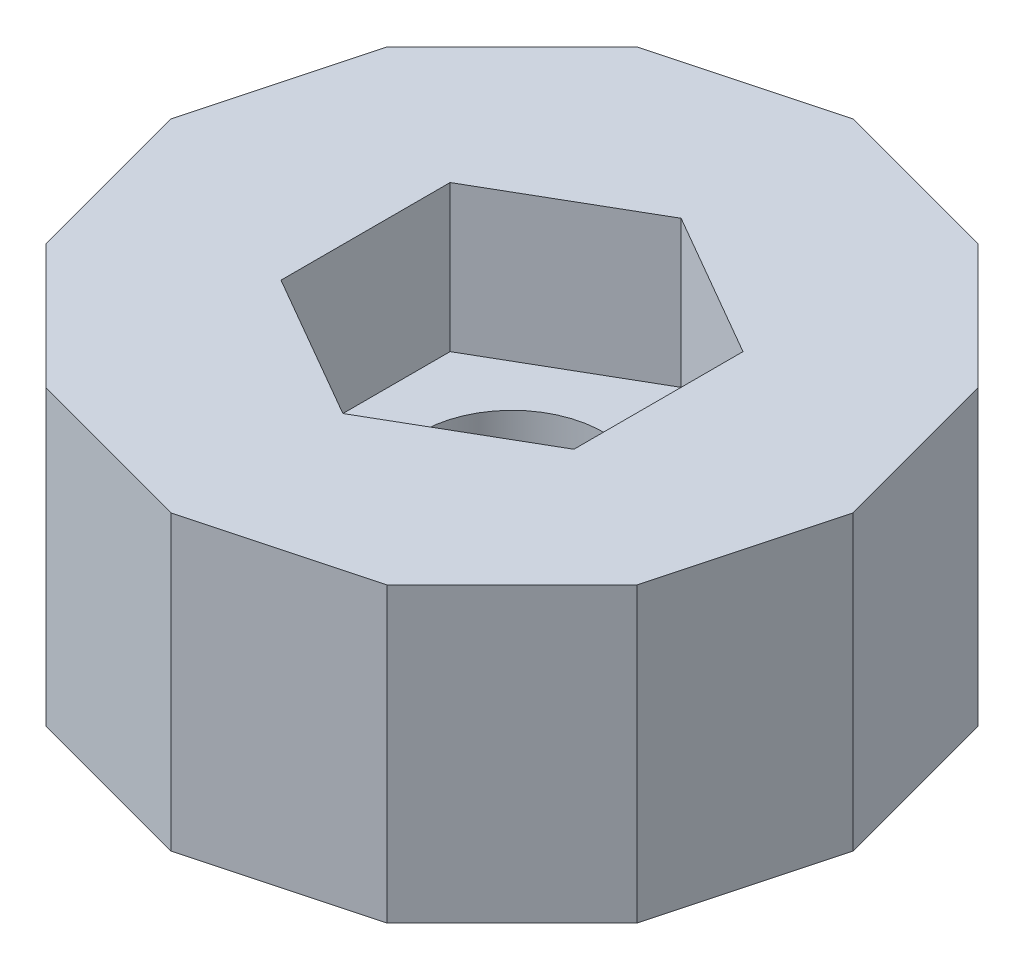
ISO-10303-21;
HEADER;
FILE_DESCRIPTION(('STEP AP214'),'2;1');
FILE_NAME('part.step','',(''),(''),'','','');
FILE_SCHEMA(('AUTOMOTIVE_DESIGN { 1 0 10303 214 1 1 1 1 }'));
ENDSEC;
DATA;
#1=APPLICATION_CONTEXT('core data for automotive mechanical design processes');
#2=APPLICATION_PROTOCOL_DEFINITION('international standard','automotive_design',2000,#1);
#3=PRODUCT_CONTEXT('',#1,'mechanical');
#4=PRODUCT('Part','Part','',(#3));
#5=PRODUCT_RELATED_PRODUCT_CATEGORY('part','',(#4));
#6=PRODUCT_DEFINITION_FORMATION('','',#4);
#7=PRODUCT_DEFINITION_CONTEXT('part definition',#1,'design');
#8=PRODUCT_DEFINITION('design','',#6,#7);
#9=PRODUCT_DEFINITION_SHAPE('','',#8);
#10=(LENGTH_UNIT() NAMED_UNIT(*) SI_UNIT(.MILLI.,.METRE.));
#11=(NAMED_UNIT(*) PLANE_ANGLE_UNIT() SI_UNIT($,.RADIAN.));
#12=(NAMED_UNIT(*) SI_UNIT($,.STERADIAN.) SOLID_ANGLE_UNIT());
#13=UNCERTAINTY_MEASURE_WITH_UNIT(LENGTH_MEASURE(1.E-05),#10,'distance_accuracy_value','');
#14=(GEOMETRIC_REPRESENTATION_CONTEXT(3) GLOBAL_UNCERTAINTY_ASSIGNED_CONTEXT((#13)) GLOBAL_UNIT_ASSIGNED_CONTEXT((#10,
#11,#12)) REPRESENTATION_CONTEXT('',''));
#15=CARTESIAN_POINT('',(0.,0.,0.));
#16=DIRECTION('',(0.,0.,1.));
#17=DIRECTION('',(1.,0.,0.));
#18=AXIS2_PLACEMENT_3D('',#15,#16,#17);
#19=CARTESIAN_POINT('',(2.,8.,-3.46410161513776));
#20=DIRECTION('',(-0.5,0.,0.866025403784439));
#21=DIRECTION('',(0.866025403784439,0.,0.5));
#22=AXIS2_PLACEMENT_3D('',#19,#20,#21);
#23=PLANE('',#22);
#24=DIRECTION('',(-0.866025403784439,0.,-0.5));
#25=VECTOR('',#24,1.);
#26=CARTESIAN_POINT('',(2.,4.,-3.46410161513776));
#27=LINE('',#26,#25);
#28=CARTESIAN_POINT('',(4.,4.,-2.30940107675851));
#29=VERTEX_POINT('',#28);
#30=CARTESIAN_POINT('',(0.,4.,-4.61880215351701));
#31=VERTEX_POINT('',#30);
#32=EDGE_CURVE('E52',#29,#31,#27,.T.);
#33=ORIENTED_EDGE('',*,*,#32,.F.);
#34=DIRECTION('',(0.,-1.,0.));
#35=VECTOR('',#34,1.);
#36=CARTESIAN_POINT('',(4.,8.,-2.30940107675851));
#37=LINE('',#36,#35);
#38=CARTESIAN_POINT('',(4.,8.,-2.30940107675851));
#39=VERTEX_POINT('',#38);
#40=EDGE_CURVE('E11',#39,#29,#37,.T.);
#41=ORIENTED_EDGE('',*,*,#40,.F.);
#42=DIRECTION('',(-0.866025403784439,0.,-0.5));
#43=VECTOR('',#42,1.);
#44=CARTESIAN_POINT('',(2.,8.,-3.46410161513776));
#45=LINE('',#44,#43);
#46=CARTESIAN_POINT('',(0.,8.,-4.61880215351701));
#47=VERTEX_POINT('',#46);
#48=EDGE_CURVE('E222',#39,#47,#45,.T.);
#49=ORIENTED_EDGE('',*,*,#48,.T.);
#50=DIRECTION('',(0.,-1.,0.));
#51=VECTOR('',#50,1.);
#52=CARTESIAN_POINT('',(0.,8.,-4.61880215351701));
#53=LINE('',#52,#51);
#54=EDGE_CURVE('E172',#47,#31,#53,.T.);
#55=ORIENTED_EDGE('',*,*,#54,.T.);
#56=EDGE_LOOP('',(#33,#41,#49,#55));
#57=FACE_BOUND('',#56,.T.);
#58=ADVANCED_FACE('F35',(#57),#23,.T.);
#59=CARTESIAN_POINT('',(4.,8.,0.));
#60=DIRECTION('',(-1.,0.,0.));
#61=DIRECTION('',(0.,0.,1.));
#62=AXIS2_PLACEMENT_3D('',#59,#60,#61);
#63=PLANE('',#62);
#64=DIRECTION('',(0.,0.,-1.));
#65=VECTOR('',#64,1.);
#66=CARTESIAN_POINT('',(4.,4.,0.));
#67=LINE('',#66,#65);
#68=CARTESIAN_POINT('',(4.,4.,2.3094010767585));
#69=VERTEX_POINT('',#68);
#70=EDGE_CURVE('E58',#69,#29,#67,.T.);
#71=ORIENTED_EDGE('',*,*,#70,.F.);
#72=DIRECTION('',(0.,-1.,0.));
#73=VECTOR('',#72,1.);
#74=CARTESIAN_POINT('',(4.,8.,2.3094010767585));
#75=LINE('',#74,#73);
#76=CARTESIAN_POINT('',(4.,8.,2.3094010767585));
#77=VERTEX_POINT('',#76);
#78=EDGE_CURVE('E44',#77,#69,#75,.T.);
#79=ORIENTED_EDGE('',*,*,#78,.F.);
#80=DIRECTION('',(0.,0.,-1.));
#81=VECTOR('',#80,1.);
#82=CARTESIAN_POINT('',(4.,8.,0.));
#83=LINE('',#82,#81);
#84=EDGE_CURVE('E225',#77,#39,#83,.T.);
#85=ORIENTED_EDGE('',*,*,#84,.T.);
#86=ORIENTED_EDGE('',*,*,#40,.T.);
#87=EDGE_LOOP('',(#71,#79,#85,#86));
#88=FACE_BOUND('',#87,.T.);
#89=ADVANCED_FACE('F370',(#88),#63,.T.);
#90=CARTESIAN_POINT('',(2.,8.,3.46410161513776));
#91=DIRECTION('',(-0.5,0.,-0.866025403784439));
#92=DIRECTION('',(-0.866025403784439,0.,0.5));
#93=AXIS2_PLACEMENT_3D('',#90,#91,#92);
#94=PLANE('',#93);
#95=DIRECTION('',(0.866025403784439,0.,-0.5));
#96=VECTOR('',#95,1.);
#97=CARTESIAN_POINT('',(2.,4.,3.46410161513776));
#98=LINE('',#97,#96);
#99=CARTESIAN_POINT('',(0.,4.,4.61880215351701));
#100=VERTEX_POINT('',#99);
#101=EDGE_CURVE('E188',#100,#69,#98,.T.);
#102=ORIENTED_EDGE('',*,*,#101,.F.);
#103=DIRECTION('',(0.,-1.,0.));
#104=VECTOR('',#103,1.);
#105=CARTESIAN_POINT('',(0.,8.,4.61880215351701));
#106=LINE('',#105,#104);
#107=CARTESIAN_POINT('',(0.,8.,4.61880215351701));
#108=VERTEX_POINT('',#107);
#109=EDGE_CURVE('E263',#108,#100,#106,.T.);
#110=ORIENTED_EDGE('',*,*,#109,.F.);
#111=DIRECTION('',(0.866025403784439,0.,-0.5));
#112=VECTOR('',#111,1.);
#113=CARTESIAN_POINT('',(2.,8.,3.46410161513776));
#114=LINE('',#113,#112);
#115=EDGE_CURVE('E228',#108,#77,#114,.T.);
#116=ORIENTED_EDGE('',*,*,#115,.T.);
#117=ORIENTED_EDGE('',*,*,#78,.T.);
#118=EDGE_LOOP('',(#102,#110,#116,#117));
#119=FACE_BOUND('',#118,.T.);
#120=ADVANCED_FACE('F375',(#119),#94,.T.);
#121=CARTESIAN_POINT('',(-2.,8.,3.46410161513776));
#122=DIRECTION('',(0.5,0.,-0.866025403784438));
#123=DIRECTION('',(-0.866025403784439,0.,-0.5));
#124=AXIS2_PLACEMENT_3D('',#121,#122,#123);
#125=PLANE('',#124);
#126=DIRECTION('',(0.866025403784439,0.,0.5));
#127=VECTOR('',#126,1.);
#128=CARTESIAN_POINT('',(-2.,4.,3.46410161513776));
#129=LINE('',#128,#127);
#130=CARTESIAN_POINT('',(-4.,4.,2.3094010767585));
#131=VERTEX_POINT('',#130);
#132=EDGE_CURVE('E180',#131,#100,#129,.T.);
#133=ORIENTED_EDGE('',*,*,#132,.F.);
#134=DIRECTION('',(0.,-1.,0.));
#135=VECTOR('',#134,1.);
#136=CARTESIAN_POINT('',(-4.,8.,2.3094010767585));
#137=LINE('',#136,#135);
#138=CARTESIAN_POINT('',(-4.,8.,2.3094010767585));
#139=VERTEX_POINT('',#138);
#140=EDGE_CURVE('E171',#139,#131,#137,.T.);
#141=ORIENTED_EDGE('',*,*,#140,.F.);
#142=DIRECTION('',(0.866025403784439,0.,0.5));
#143=VECTOR('',#142,1.);
#144=CARTESIAN_POINT('',(-2.,8.,3.46410161513776));
#145=LINE('',#144,#143);
#146=EDGE_CURVE('E231',#139,#108,#145,.T.);
#147=ORIENTED_EDGE('',*,*,#146,.T.);
#148=ORIENTED_EDGE('',*,*,#109,.T.);
#149=EDGE_LOOP('',(#133,#141,#147,#148));
#150=FACE_BOUND('',#149,.T.);
#151=ADVANCED_FACE('F548',(#150),#125,.T.);
#152=CARTESIAN_POINT('',(-4.,8.,0.));
#153=DIRECTION('',(1.,0.,0.));
#154=DIRECTION('',(0.,0.,-1.));
#155=AXIS2_PLACEMENT_3D('',#152,#153,#154);
#156=PLANE('',#155);
#157=DIRECTION('',(0.,0.,1.));
#158=VECTOR('',#157,1.);
#159=CARTESIAN_POINT('',(-4.,4.,0.));
#160=LINE('',#159,#158);
#161=CARTESIAN_POINT('',(-4.,4.,-2.30940107675851));
#162=VERTEX_POINT('',#161);
#163=EDGE_CURVE('E176',#162,#131,#160,.T.);
#164=ORIENTED_EDGE('',*,*,#163,.F.);
#165=DIRECTION('',(0.,-1.,0.));
#166=VECTOR('',#165,1.);
#167=CARTESIAN_POINT('',(-4.,8.,-2.30940107675851));
#168=LINE('',#167,#166);
#169=CARTESIAN_POINT('',(-4.,8.,-2.30940107675851));
#170=VERTEX_POINT('',#169);
#171=EDGE_CURVE('E161',#170,#162,#168,.T.);
#172=ORIENTED_EDGE('',*,*,#171,.F.);
#173=DIRECTION('',(0.,0.,1.));
#174=VECTOR('',#173,1.);
#175=CARTESIAN_POINT('',(-4.,8.,0.));
#176=LINE('',#175,#174);
#177=EDGE_CURVE('E234',#170,#139,#176,.T.);
#178=ORIENTED_EDGE('',*,*,#177,.T.);
#179=ORIENTED_EDGE('',*,*,#140,.T.);
#180=EDGE_LOOP('',(#164,#172,#178,#179));
#181=FACE_BOUND('',#180,.T.);
#182=ADVANCED_FACE('F177',(#181),#156,.T.);
#183=CARTESIAN_POINT('',(6.36396103067896,8.,6.3639610306789));
#184=DIRECTION('',(-0.707106781186551,0.,-0.707106781186544));
#185=DIRECTION('',(-0.707106781186544,0.,0.707106781186551));
#186=AXIS2_PLACEMENT_3D('',#183,#184,#185);
#187=PLANE('',#186);
#188=DIRECTION('',(0.707106781186544,0.,-0.707106781186551));
#189=VECTOR('',#188,1.);
#190=CARTESIAN_POINT('',(6.36396103067896,0.,6.3639610306789));
#191=LINE('',#190,#189);
#192=CARTESIAN_POINT('',(4.65874281184544,0.,8.06917924951243));
#193=VERTEX_POINT('',#192);
#194=CARTESIAN_POINT('',(8.06917924951247,0.,4.65874281184537));
#195=VERTEX_POINT('',#194);
#196=EDGE_CURVE('E191',#193,#195,#191,.T.);
#197=ORIENTED_EDGE('',*,*,#196,.T.);
#198=DIRECTION('',(0.,-1.,0.));
#199=VECTOR('',#198,1.);
#200=CARTESIAN_POINT('',(8.06917924951247,8.,4.65874281184537));
#201=LINE('',#200,#199);
#202=CARTESIAN_POINT('',(8.06917924951247,8.,4.65874281184537));
#203=VERTEX_POINT('',#202);
#204=EDGE_CURVE('E39',#203,#195,#201,.T.);
#205=ORIENTED_EDGE('',*,*,#204,.F.);
#206=DIRECTION('',(0.707106781186544,0.,-0.707106781186551));
#207=VECTOR('',#206,1.);
#208=CARTESIAN_POINT('',(6.36396103067896,8.,6.3639610306789));
#209=LINE('',#208,#207);
#210=CARTESIAN_POINT('',(4.65874281184544,8.,8.06917924951243));
#211=VERTEX_POINT('',#210);
#212=EDGE_CURVE('E196',#211,#203,#209,.T.);
#213=ORIENTED_EDGE('',*,*,#212,.F.);
#214=DIRECTION('',(0.,-1.,0.));
#215=VECTOR('',#214,1.);
#216=CARTESIAN_POINT('',(4.65874281184544,8.,8.06917924951243));
#217=LINE('',#216,#215);
#218=EDGE_CURVE('E237',#211,#193,#217,.T.);
#219=ORIENTED_EDGE('',*,*,#218,.T.);
#220=EDGE_LOOP('',(#197,#205,#213,#219));
#221=FACE_BOUND('',#220,.T.);
#222=ADVANCED_FACE('F37',(#221),#187,.F.);
#223=CARTESIAN_POINT('',(8.6933324366016,8.,2.32937140592265));
#224=DIRECTION('',(-0.965925826289069,0.,-0.258819045102517));
#225=DIRECTION('',(-0.258819045102518,0.,0.965925826289069));
#226=AXIS2_PLACEMENT_3D('',#223,#224,#225);
#227=PLANE('',#226);
#228=DIRECTION('',(0.258819045102518,0.,-0.965925826289069));
#229=VECTOR('',#228,1.);
#230=CARTESIAN_POINT('',(8.6933324366016,0.,2.32937140592265));
#231=LINE('',#230,#229);
#232=CARTESIAN_POINT('',(9.31748562369073,0.,0.));
#233=VERTEX_POINT('',#232);
#234=EDGE_CURVE('E240',#195,#233,#231,.T.);
#235=ORIENTED_EDGE('',*,*,#234,.T.);
#236=DIRECTION('',(0.,-1.,0.));
#237=VECTOR('',#236,1.);
#238=CARTESIAN_POINT('',(9.31748562369073,8.,0.));
#239=LINE('',#238,#237);
#240=CARTESIAN_POINT('',(9.31748562369073,8.,0.));
#241=VERTEX_POINT('',#240);
#242=EDGE_CURVE('E295',#241,#233,#239,.T.);
#243=ORIENTED_EDGE('',*,*,#242,.F.);
#244=DIRECTION('',(0.258819045102518,0.,-0.965925826289069));
#245=VECTOR('',#244,1.);
#246=CARTESIAN_POINT('',(8.6933324366016,8.,2.32937140592265));
#247=LINE('',#246,#245);
#248=EDGE_CURVE('E199',#203,#241,#247,.T.);
#249=ORIENTED_EDGE('',*,*,#248,.F.);
#250=ORIENTED_EDGE('',*,*,#204,.T.);
#251=EDGE_LOOP('',(#235,#243,#249,#250));
#252=FACE_BOUND('',#251,.T.);
#253=ADVANCED_FACE('F304',(#252),#227,.F.);
#254=CARTESIAN_POINT('',(8.6933324366016,8.,-2.32937140592273));
#255=DIRECTION('',(-0.965925826289067,0.,0.258819045102526));
#256=DIRECTION('',(0.258819045102526,0.,0.965925826289067));
#257=AXIS2_PLACEMENT_3D('',#254,#255,#256);
#258=PLANE('',#257);
#259=DIRECTION('',(-0.258819045102526,0.,-0.965925826289067));
#260=VECTOR('',#259,1.);
#261=CARTESIAN_POINT('',(8.6933324366016,0.,-2.32937140592273));
#262=LINE('',#261,#260);
#263=CARTESIAN_POINT('',(8.06917924951247,0.,-4.65874281184537));
#264=VERTEX_POINT('',#263);
#265=EDGE_CURVE('E242',#233,#264,#262,.T.);
#266=ORIENTED_EDGE('',*,*,#265,.T.);
#267=DIRECTION('',(0.,-1.,0.));
#268=VECTOR('',#267,1.);
#269=CARTESIAN_POINT('',(8.06917924951247,8.,-4.65874281184537));
#270=LINE('',#269,#268);
#271=CARTESIAN_POINT('',(8.06917924951247,8.,-4.65874281184537));
#272=VERTEX_POINT('',#271);
#273=EDGE_CURVE('E293',#272,#264,#270,.T.);
#274=ORIENTED_EDGE('',*,*,#273,.F.);
#275=DIRECTION('',(-0.258819045102526,0.,-0.965925826289067));
#276=VECTOR('',#275,1.);
#277=CARTESIAN_POINT('',(8.6933324366016,8.,-2.32937140592273));
#278=LINE('',#277,#276);
#279=EDGE_CURVE('E202',#241,#272,#278,.T.);
#280=ORIENTED_EDGE('',*,*,#279,.F.);
#281=ORIENTED_EDGE('',*,*,#242,.T.);
#282=EDGE_LOOP('',(#266,#274,#280,#281));
#283=FACE_BOUND('',#282,.T.);
#284=ADVANCED_FACE('F317',(#283),#258,.F.);
#285=CARTESIAN_POINT('',(6.36396103067892,8.,-6.36396103067892));
#286=DIRECTION('',(-0.707106781186547,0.,0.707106781186547));
#287=DIRECTION('',(0.707106781186548,0.,0.707106781186548));
#288=AXIS2_PLACEMENT_3D('',#285,#286,#287);
#289=PLANE('',#288);
#290=DIRECTION('',(-0.707106781186548,0.,-0.707106781186548));
#291=VECTOR('',#290,1.);
#292=CARTESIAN_POINT('',(6.36396103067892,0.,-6.36396103067892));
#293=LINE('',#292,#291);
#294=CARTESIAN_POINT('',(4.65874281184532,0.,-8.06917924951252));
#295=VERTEX_POINT('',#294);
#296=EDGE_CURVE('E244',#264,#295,#293,.T.);
#297=ORIENTED_EDGE('',*,*,#296,.T.);
#298=DIRECTION('',(0.,-1.,0.));
#299=VECTOR('',#298,1.);
#300=CARTESIAN_POINT('',(4.65874281184532,8.,-8.06917924951252));
#301=LINE('',#300,#299);
#302=CARTESIAN_POINT('',(4.65874281184532,8.,-8.06917924951252));
#303=VERTEX_POINT('',#302);
#304=EDGE_CURVE('E290',#303,#295,#301,.T.);
#305=ORIENTED_EDGE('',*,*,#304,.F.);
#306=DIRECTION('',(-0.707106781186548,0.,-0.707106781186548));
#307=VECTOR('',#306,1.);
#308=CARTESIAN_POINT('',(6.36396103067892,8.,-6.36396103067892));
#309=LINE('',#308,#307);
#310=EDGE_CURVE('E204',#272,#303,#309,.T.);
#311=ORIENTED_EDGE('',*,*,#310,.F.);
#312=ORIENTED_EDGE('',*,*,#273,.T.);
#313=EDGE_LOOP('',(#297,#305,#311,#312));
#314=FACE_BOUND('',#313,.T.);
#315=ADVANCED_FACE('F320',(#314),#289,.F.);
#316=CARTESIAN_POINT('',(2.32937140592263,8.,-8.69333243660163));
#317=DIRECTION('',(-0.258819045102514,0.,0.96592582628907));
#318=DIRECTION('',(0.96592582628907,0.,0.258819045102514));
#319=AXIS2_PLACEMENT_3D('',#316,#317,#318);
#320=PLANE('',#319);
#321=DIRECTION('',(-0.96592582628907,0.,-0.258819045102514));
#322=VECTOR('',#321,1.);
#323=CARTESIAN_POINT('',(2.32937140592263,0.,-8.69333243660163));
#324=LINE('',#323,#322);
#325=CARTESIAN_POINT('',(0.,0.,-9.31748562369073));
#326=VERTEX_POINT('',#325);
#327=EDGE_CURVE('E246',#295,#326,#324,.T.);
#328=ORIENTED_EDGE('',*,*,#327,.T.);
#329=DIRECTION('',(0.,-1.,0.));
#330=VECTOR('',#329,1.);
#331=CARTESIAN_POINT('',(0.,8.,-9.31748562369073));
#332=LINE('',#331,#330);
#333=CARTESIAN_POINT('',(0.,8.,-9.31748562369073));
#334=VERTEX_POINT('',#333);
#335=EDGE_CURVE('E287',#334,#326,#332,.T.);
#336=ORIENTED_EDGE('',*,*,#335,.F.);
#337=DIRECTION('',(-0.96592582628907,0.,-0.258819045102514));
#338=VECTOR('',#337,1.);
#339=CARTESIAN_POINT('',(2.32937140592263,8.,-8.69333243660163));
#340=LINE('',#339,#338);
#341=EDGE_CURVE('E206',#303,#334,#340,.T.);
#342=ORIENTED_EDGE('',*,*,#341,.F.);
#343=ORIENTED_EDGE('',*,*,#304,.T.);
#344=EDGE_LOOP('',(#328,#336,#342,#343));
#345=FACE_BOUND('',#344,.T.);
#346=ADVANCED_FACE('F360',(#345),#320,.F.);
#347=CARTESIAN_POINT('',(-2.32937140592273,8.,-8.69333243660158));
#348=DIRECTION('',(0.258819045102526,0.,0.965925826289067));
#349=DIRECTION('',(0.965925826289067,0.,-0.258819045102526));
#350=AXIS2_PLACEMENT_3D('',#347,#348,#349);
#351=PLANE('',#350);
#352=DIRECTION('',(-0.965925826289067,0.,0.258819045102526));
#353=VECTOR('',#352,1.);
#354=CARTESIAN_POINT('',(-2.32937140592273,0.,-8.69333243660158));
#355=LINE('',#354,#353);
#356=CARTESIAN_POINT('',(-4.65874281184541,0.,-8.06917924951243));
#357=VERTEX_POINT('',#356);
#358=EDGE_CURVE('E248',#326,#357,#355,.T.);
#359=ORIENTED_EDGE('',*,*,#358,.T.);
#360=DIRECTION('',(0.,-1.,0.));
#361=VECTOR('',#360,1.);
#362=CARTESIAN_POINT('',(-4.65874281184541,8.,-8.06917924951243));
#363=LINE('',#362,#361);
#364=CARTESIAN_POINT('',(-4.65874281184541,8.,-8.06917924951243));
#365=VERTEX_POINT('',#364);
#366=EDGE_CURVE('E284',#365,#357,#363,.T.);
#367=ORIENTED_EDGE('',*,*,#366,.F.);
#368=DIRECTION('',(-0.965925826289067,0.,0.258819045102526));
#369=VECTOR('',#368,1.);
#370=CARTESIAN_POINT('',(-2.32937140592273,8.,-8.69333243660158));
#371=LINE('',#370,#369);
#372=EDGE_CURVE('E208',#334,#365,#371,.T.);
#373=ORIENTED_EDGE('',*,*,#372,.F.);
#374=ORIENTED_EDGE('',*,*,#335,.T.);
#375=EDGE_LOOP('',(#359,#367,#373,#374));
#376=FACE_BOUND('',#375,.T.);
#377=ADVANCED_FACE('F358',(#376),#351,.F.);
#378=CARTESIAN_POINT('',(-6.36396103067892,8.,-6.36396103067892));
#379=DIRECTION('',(0.707106781186547,0.,0.707106781186547));
#380=DIRECTION('',(0.707106781186548,0.,-0.707106781186548));
#381=AXIS2_PLACEMENT_3D('',#378,#379,#380);
#382=PLANE('',#381);
#383=DIRECTION('',(-0.707106781186548,0.,0.707106781186548));
#384=VECTOR('',#383,1.);
#385=CARTESIAN_POINT('',(-6.36396103067892,0.,-6.36396103067892));
#386=LINE('',#385,#384);
#387=CARTESIAN_POINT('',(-8.06917924951248,0.,-4.65874281184537));
#388=VERTEX_POINT('',#387);
#389=EDGE_CURVE('E250',#357,#388,#386,.T.);
#390=ORIENTED_EDGE('',*,*,#389,.T.);
#391=DIRECTION('',(0.,-1.,0.));
#392=VECTOR('',#391,1.);
#393=CARTESIAN_POINT('',(-8.06917924951248,8.,-4.65874281184537));
#394=LINE('',#393,#392);
#395=CARTESIAN_POINT('',(-8.06917924951248,8.,-4.65874281184537));
#396=VERTEX_POINT('',#395);
#397=EDGE_CURVE('E281',#396,#388,#394,.T.);
#398=ORIENTED_EDGE('',*,*,#397,.F.);
#399=DIRECTION('',(-0.707106781186548,0.,0.707106781186548));
#400=VECTOR('',#399,1.);
#401=CARTESIAN_POINT('',(-6.36396103067892,8.,-6.36396103067892));
#402=LINE('',#401,#400);
#403=EDGE_CURVE('E210',#365,#396,#402,.T.);
#404=ORIENTED_EDGE('',*,*,#403,.F.);
#405=ORIENTED_EDGE('',*,*,#366,.T.);
#406=EDGE_LOOP('',(#390,#398,#404,#405));
#407=FACE_BOUND('',#406,.T.);
#408=ADVANCED_FACE('F353',(#407),#382,.F.);
#409=CARTESIAN_POINT('',(-8.69333243660161,8.,-2.32937140592265));
#410=DIRECTION('',(0.965925826289069,0.,0.258819045102518));
#411=DIRECTION('',(0.258819045102518,0.,-0.965925826289069));
#412=AXIS2_PLACEMENT_3D('',#409,#410,#411);
#413=PLANE('',#412);
#414=DIRECTION('',(-0.258819045102518,0.,0.965925826289069));
#415=VECTOR('',#414,1.);
#416=CARTESIAN_POINT('',(-8.69333243660161,0.,-2.32937140592265));
#417=LINE('',#416,#415);
#418=CARTESIAN_POINT('',(-9.31748562369074,0.,0.));
#419=VERTEX_POINT('',#418);
#420=EDGE_CURVE('E252',#388,#419,#417,.T.);
#421=ORIENTED_EDGE('',*,*,#420,.T.);
#422=DIRECTION('',(0.,-1.,0.));
#423=VECTOR('',#422,1.);
#424=CARTESIAN_POINT('',(-9.31748562369074,8.,0.));
#425=LINE('',#424,#423);
#426=CARTESIAN_POINT('',(-9.31748562369074,8.,0.));
#427=VERTEX_POINT('',#426);
#428=EDGE_CURVE('E278',#427,#419,#425,.T.);
#429=ORIENTED_EDGE('',*,*,#428,.F.);
#430=DIRECTION('',(-0.258819045102518,0.,0.965925826289069));
#431=VECTOR('',#430,1.);
#432=CARTESIAN_POINT('',(-8.69333243660161,8.,-2.32937140592265));
#433=LINE('',#432,#431);
#434=EDGE_CURVE('E212',#396,#427,#433,.T.);
#435=ORIENTED_EDGE('',*,*,#434,.F.);
#436=ORIENTED_EDGE('',*,*,#397,.T.);
#437=EDGE_LOOP('',(#421,#429,#435,#436));
#438=FACE_BOUND('',#437,.T.);
#439=ADVANCED_FACE('F348',(#438),#413,.F.);
#440=CARTESIAN_POINT('',(-8.69333243660161,8.,2.3293714059227));
#441=DIRECTION('',(0.965925826289068,0.,-0.258819045102523));
#442=DIRECTION('',(-0.258819045102523,0.,-0.965925826289068));
#443=AXIS2_PLACEMENT_3D('',#440,#441,#442);
#444=PLANE('',#443);
#445=DIRECTION('',(0.258819045102523,0.,0.965925826289068));
#446=VECTOR('',#445,1.);
#447=CARTESIAN_POINT('',(-8.69333243660161,0.,2.3293714059227));
#448=LINE('',#447,#446);
#449=CARTESIAN_POINT('',(-8.06917924951248,0.,4.65874281184537));
#450=VERTEX_POINT('',#449);
#451=EDGE_CURVE('E254',#419,#450,#448,.T.);
#452=ORIENTED_EDGE('',*,*,#451,.T.);
#453=DIRECTION('',(0.,-1.,0.));
#454=VECTOR('',#453,1.);
#455=CARTESIAN_POINT('',(-8.06917924951248,8.,4.65874281184537));
#456=LINE('',#455,#454);
#457=CARTESIAN_POINT('',(-8.06917924951248,8.,4.65874281184537));
#458=VERTEX_POINT('',#457);
#459=EDGE_CURVE('E275',#458,#450,#456,.T.);
#460=ORIENTED_EDGE('',*,*,#459,.F.);
#461=DIRECTION('',(0.258819045102523,0.,0.965925826289068));
#462=VECTOR('',#461,1.);
#463=CARTESIAN_POINT('',(-8.69333243660161,8.,2.3293714059227));
#464=LINE('',#463,#462);
#465=EDGE_CURVE('E214',#427,#458,#464,.T.);
#466=ORIENTED_EDGE('',*,*,#465,.F.);
#467=ORIENTED_EDGE('',*,*,#428,.T.);
#468=EDGE_LOOP('',(#452,#460,#466,#467));
#469=FACE_BOUND('',#468,.T.);
#470=ADVANCED_FACE('F344',(#469),#444,.F.);
#471=CARTESIAN_POINT('',(-6.36396103067892,8.,6.36396103067892));
#472=DIRECTION('',(0.707106781186547,0.,-0.707106781186547));
#473=DIRECTION('',(-0.707106781186548,0.,-0.707106781186548));
#474=AXIS2_PLACEMENT_3D('',#471,#472,#473);
#475=PLANE('',#474);
#476=DIRECTION('',(0.707106781186548,0.,0.707106781186548));
#477=VECTOR('',#476,1.);
#478=CARTESIAN_POINT('',(-6.36396103067892,0.,6.36396103067892));
#479=LINE('',#478,#477);
#480=CARTESIAN_POINT('',(-4.65874281184535,0.,8.0691792495125));
#481=VERTEX_POINT('',#480);
#482=EDGE_CURVE('E256',#450,#481,#479,.T.);
#483=ORIENTED_EDGE('',*,*,#482,.T.);
#484=DIRECTION('',(0.,-1.,0.));
#485=VECTOR('',#484,1.);
#486=CARTESIAN_POINT('',(-4.65874281184535,8.,8.0691792495125));
#487=LINE('',#486,#485);
#488=CARTESIAN_POINT('',(-4.65874281184535,8.,8.0691792495125));
#489=VERTEX_POINT('',#488);
#490=EDGE_CURVE('E272',#489,#481,#487,.T.);
#491=ORIENTED_EDGE('',*,*,#490,.F.);
#492=DIRECTION('',(0.707106781186548,0.,0.707106781186548));
#493=VECTOR('',#492,1.);
#494=CARTESIAN_POINT('',(-6.36396103067892,8.,6.36396103067892));
#495=LINE('',#494,#493);
#496=EDGE_CURVE('E216',#458,#489,#495,.T.);
#497=ORIENTED_EDGE('',*,*,#496,.F.);
#498=ORIENTED_EDGE('',*,*,#459,.T.);
#499=EDGE_LOOP('',(#483,#491,#497,#498));
#500=FACE_BOUND('',#499,.T.);
#501=ADVANCED_FACE('F339',(#500),#475,.F.);
#502=CARTESIAN_POINT('',(-2.32937140592266,8.,8.69333243660162));
#503=DIRECTION('',(0.258819045102518,0.,-0.965925826289069));
#504=DIRECTION('',(-0.965925826289069,0.,-0.258819045102518));
#505=AXIS2_PLACEMENT_3D('',#502,#503,#504);
#506=PLANE('',#505);
#507=DIRECTION('',(0.965925826289069,0.,0.258819045102518));
#508=VECTOR('',#507,1.);
#509=CARTESIAN_POINT('',(-2.32937140592266,0.,8.69333243660162));
#510=LINE('',#509,#508);
#511=CARTESIAN_POINT('',(0.,0.,9.31748562369074));
#512=VERTEX_POINT('',#511);
#513=EDGE_CURVE('E258',#481,#512,#510,.T.);
#514=ORIENTED_EDGE('',*,*,#513,.T.);
#515=DIRECTION('',(0.,-1.,0.));
#516=VECTOR('',#515,1.);
#517=CARTESIAN_POINT('',(0.,8.,9.31748562369074));
#518=LINE('',#517,#516);
#519=CARTESIAN_POINT('',(0.,8.,9.31748562369074));
#520=VERTEX_POINT('',#519);
#521=EDGE_CURVE('E269',#520,#512,#518,.T.);
#522=ORIENTED_EDGE('',*,*,#521,.F.);
#523=DIRECTION('',(0.965925826289069,0.,0.258819045102518));
#524=VECTOR('',#523,1.);
#525=CARTESIAN_POINT('',(-2.32937140592266,8.,8.69333243660162));
#526=LINE('',#525,#524);
#527=EDGE_CURVE('E218',#489,#520,#526,.T.);
#528=ORIENTED_EDGE('',*,*,#527,.F.);
#529=ORIENTED_EDGE('',*,*,#490,.T.);
#530=EDGE_LOOP('',(#514,#522,#528,#529));
#531=FACE_BOUND('',#530,.T.);
#532=ADVANCED_FACE('F333',(#531),#506,.F.);
#533=CARTESIAN_POINT('',(2.32937140592273,8.,8.69333243660158));
#534=DIRECTION('',(-0.258819045102526,0.,-0.965925826289067));
#535=DIRECTION('',(-0.965925826289067,0.,0.258819045102526));
#536=AXIS2_PLACEMENT_3D('',#533,#534,#535);
#537=PLANE('',#536);
#538=DIRECTION('',(0.965925826289067,0.,-0.258819045102526));
#539=VECTOR('',#538,1.);
#540=CARTESIAN_POINT('',(2.32937140592273,0.,8.69333243660158));
#541=LINE('',#540,#539);
#542=EDGE_CURVE('E200',#512,#193,#541,.T.);
#543=ORIENTED_EDGE('',*,*,#542,.T.);
#544=ORIENTED_EDGE('',*,*,#218,.F.);
#545=DIRECTION('',(0.965925826289067,0.,-0.258819045102526));
#546=VECTOR('',#545,1.);
#547=CARTESIAN_POINT('',(2.32937140592273,8.,8.69333243660158));
#548=LINE('',#547,#546);
#549=EDGE_CURVE('E220',#520,#211,#548,.T.);
#550=ORIENTED_EDGE('',*,*,#549,.F.);
#551=ORIENTED_EDGE('',*,*,#521,.T.);
#552=EDGE_LOOP('',(#543,#544,#550,#551));
#553=FACE_BOUND('',#552,.T.);
#554=ADVANCED_FACE('F331',(#553),#537,.F.);
#555=CARTESIAN_POINT('',(-2.,8.,-3.46410161513776));
#556=DIRECTION('',(0.5,0.,0.866025403784439));
#557=DIRECTION('',(0.866025403784439,0.,-0.5));
#558=AXIS2_PLACEMENT_3D('',#555,#556,#557);
#559=PLANE('',#558);
#560=DIRECTION('',(-0.866025403784439,0.,0.5));
#561=VECTOR('',#560,1.);
#562=CARTESIAN_POINT('',(-2.,4.,-3.46410161513776));
#563=LINE('',#562,#561);
#564=EDGE_CURVE('E165',#31,#162,#563,.T.);
#565=ORIENTED_EDGE('',*,*,#564,.F.);
#566=ORIENTED_EDGE('',*,*,#54,.F.);
#567=DIRECTION('',(-0.866025403784439,0.,0.5));
#568=VECTOR('',#567,1.);
#569=CARTESIAN_POINT('',(-2.,8.,-3.46410161513776));
#570=LINE('',#569,#568);
#571=EDGE_CURVE('E167',#47,#170,#570,.T.);
#572=ORIENTED_EDGE('',*,*,#571,.T.);
#573=ORIENTED_EDGE('',*,*,#171,.T.);
#574=EDGE_LOOP('',(#565,#566,#572,#573));
#575=FACE_BOUND('',#574,.T.);
#576=ADVANCED_FACE('F163',(#575),#559,.T.);
#577=CARTESIAN_POINT('',(0.,8.,0.));
#578=DIRECTION('',(0.,1.,0.));
#579=DIRECTION('',(0.,0.,1.));
#580=AXIS2_PLACEMENT_3D('',#577,#578,#579);
#581=PLANE('',#580);
#582=ORIENTED_EDGE('',*,*,#212,.T.);
#583=ORIENTED_EDGE('',*,*,#248,.T.);
#584=ORIENTED_EDGE('',*,*,#279,.T.);
#585=ORIENTED_EDGE('',*,*,#310,.T.);
#586=ORIENTED_EDGE('',*,*,#341,.T.);
#587=ORIENTED_EDGE('',*,*,#372,.T.);
#588=ORIENTED_EDGE('',*,*,#403,.T.);
#589=ORIENTED_EDGE('',*,*,#434,.T.);
#590=ORIENTED_EDGE('',*,*,#465,.T.);
#591=ORIENTED_EDGE('',*,*,#496,.T.);
#592=ORIENTED_EDGE('',*,*,#527,.T.);
#593=ORIENTED_EDGE('',*,*,#549,.T.);
#594=EDGE_LOOP('',(#582,#583,#584,#585,#586,#587,#588,#589,#590,#591,#592,#593));
#595=FACE_BOUND('',#594,.T.);
#596=ORIENTED_EDGE('',*,*,#48,.F.);
#597=ORIENTED_EDGE('',*,*,#84,.F.);
#598=ORIENTED_EDGE('',*,*,#115,.F.);
#599=ORIENTED_EDGE('',*,*,#146,.F.);
#600=ORIENTED_EDGE('',*,*,#177,.F.);
#601=ORIENTED_EDGE('',*,*,#571,.F.);
#602=EDGE_LOOP('',(#596,#597,#598,#599,#600,#601));
#603=FACE_BOUND('',#602,.T.);
#604=ADVANCED_FACE('F324',(#595,#603),#581,.T.);
#605=CARTESIAN_POINT('',(0.,0.,0.));
#606=DIRECTION('',(0.,1.,0.));
#607=DIRECTION('',(0.,0.,1.));
#608=AXIS2_PLACEMENT_3D('',#605,#606,#607);
#609=PLANE('',#608);
#610=ORIENTED_EDGE('',*,*,#196,.F.);
#611=ORIENTED_EDGE('',*,*,#542,.F.);
#612=ORIENTED_EDGE('',*,*,#513,.F.);
#613=ORIENTED_EDGE('',*,*,#482,.F.);
#614=ORIENTED_EDGE('',*,*,#451,.F.);
#615=ORIENTED_EDGE('',*,*,#420,.F.);
#616=ORIENTED_EDGE('',*,*,#389,.F.);
#617=ORIENTED_EDGE('',*,*,#358,.F.);
#618=ORIENTED_EDGE('',*,*,#327,.F.);
#619=ORIENTED_EDGE('',*,*,#296,.F.);
#620=ORIENTED_EDGE('',*,*,#265,.F.);
#621=ORIENTED_EDGE('',*,*,#234,.F.);
#622=EDGE_LOOP('',(#610,#611,#612,#613,#614,#615,#616,#617,#618,#619,#620,#621));
#623=FACE_BOUND('',#622,.T.);
#624=CARTESIAN_POINT('',(0.,0.,0.));
#625=DIRECTION('',(0.,1.,0.));
#626=DIRECTION('',(0.,0.,1.));
#627=AXIS2_PLACEMENT_3D('',#624,#625,#626);
#628=CIRCLE('',#627,2.5);
#629=CARTESIAN_POINT('',(0.,0.,2.5));
#630=VERTEX_POINT('',#629);
#631=EDGE_CURVE('E192',#630,#630,#628,.T.);
#632=ORIENTED_EDGE('',*,*,#631,.T.);
#633=EDGE_LOOP('',(#632));
#634=FACE_BOUND('',#633,.T.);
#635=ADVANCED_FACE('F311',(#623,#634),#609,.F.);
#636=CARTESIAN_POINT('',(0.,4.,0.));
#637=DIRECTION('',(0.,-1.,0.));
#638=DIRECTION('',(0.,0.,-1.));
#639=AXIS2_PLACEMENT_3D('',#636,#637,#638);
#640=CYLINDRICAL_SURFACE('',#639,2.5);
#641=CARTESIAN_POINT('',(0.,4.,0.));
#642=DIRECTION('',(0.,1.,0.));
#643=DIRECTION('',(0.,0.,1.));
#644=AXIS2_PLACEMENT_3D('',#641,#642,#643);
#645=CIRCLE('',#644,2.5);
#646=CARTESIAN_POINT('',(0.,4.,2.5));
#647=VERTEX_POINT('',#646);
#648=EDGE_CURVE('E195',#647,#647,#645,.T.);
#649=ORIENTED_EDGE('',*,*,#648,.T.);
#650=EDGE_LOOP('',(#649));
#651=FACE_BOUND('',#650,.T.);
#652=ORIENTED_EDGE('',*,*,#631,.F.);
#653=EDGE_LOOP('',(#652));
#654=FACE_BOUND('',#653,.T.);
#655=ADVANCED_FACE('F433',(#651,#654),#640,.F.);
#656=CARTESIAN_POINT('',(0.,4.,0.));
#657=DIRECTION('',(0.,1.,0.));
#658=DIRECTION('',(0.,0.,1.));
#659=AXIS2_PLACEMENT_3D('',#656,#657,#658);
#660=PLANE('',#659);
#661=ORIENTED_EDGE('',*,*,#648,.F.);
#662=EDGE_LOOP('',(#661));
#663=FACE_BOUND('',#662,.T.);
#664=ORIENTED_EDGE('',*,*,#70,.T.);
#665=ORIENTED_EDGE('',*,*,#32,.T.);
#666=ORIENTED_EDGE('',*,*,#564,.T.);
#667=ORIENTED_EDGE('',*,*,#163,.T.);
#668=ORIENTED_EDGE('',*,*,#132,.T.);
#669=ORIENTED_EDGE('',*,*,#101,.T.);
#670=EDGE_LOOP('',(#664,#665,#666,#667,#668,#669));
#671=FACE_BOUND('',#670,.T.);
#672=ADVANCED_FACE('F182',(#663,#671),#660,.T.);
#673=CLOSED_SHELL('',(#58,#89,#120,#151,#182,#222,#253,#284,#315,#346,#377,#408,#439,#470,#501,
#532,#554,#576,#604,#635,#655,#672));
#674=MANIFOLD_SOLID_BREP('B2',#673);
#675=ADVANCED_BREP_SHAPE_REPRESENTATION('',(#18,#674),#14);
#676=SHAPE_DEFINITION_REPRESENTATION(#9,#675);
ENDSEC;
END-ISO-10303-21;
